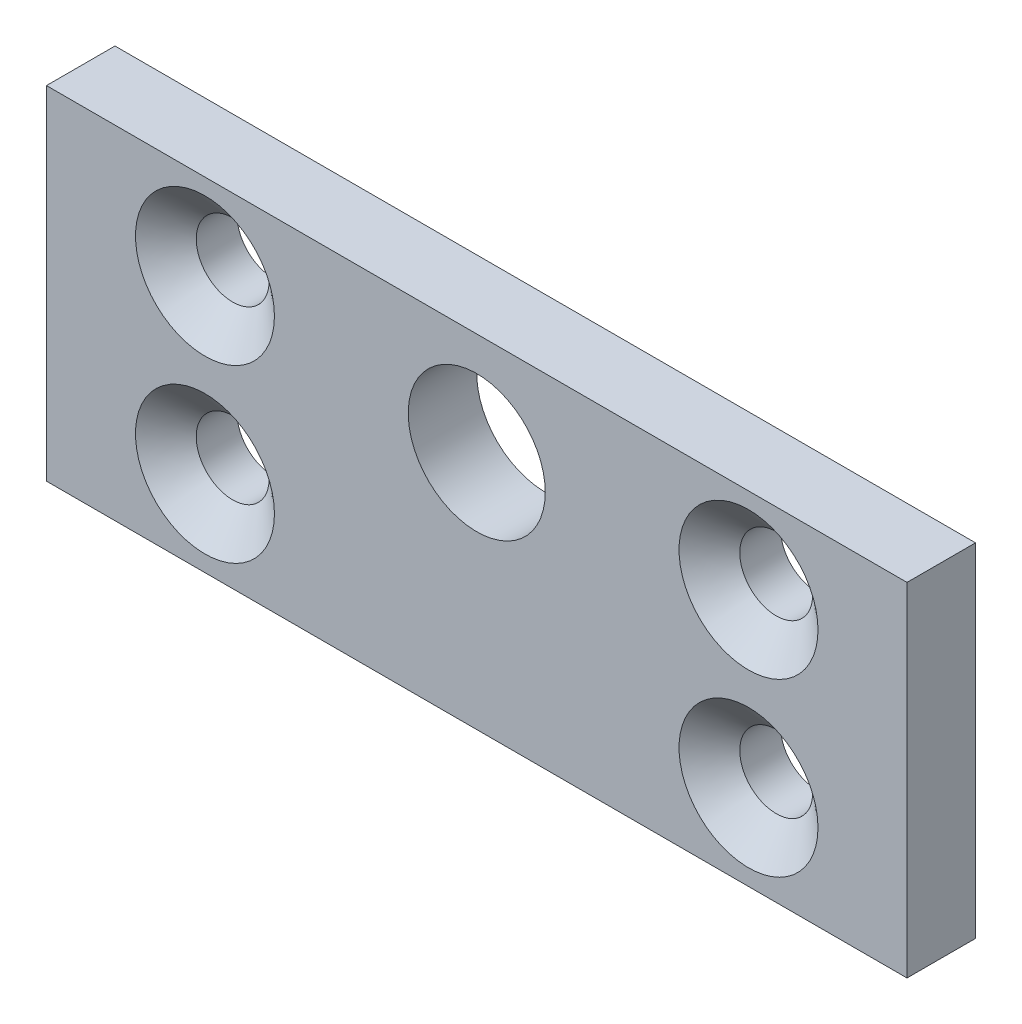
ISO-10303-21;
HEADER;
FILE_DESCRIPTION(('STEP AP214'),'2;1');
FILE_NAME('part.step','',(''),(''),'','','');
FILE_SCHEMA(('AUTOMOTIVE_DESIGN { 1 0 10303 214 1 1 1 1 }'));
ENDSEC;
DATA;
#1=APPLICATION_CONTEXT('core data for automotive mechanical design processes');
#2=APPLICATION_PROTOCOL_DEFINITION('international standard','automotive_design',2000,#1);
#3=PRODUCT_CONTEXT('',#1,'mechanical');
#4=PRODUCT('Part','Part','',(#3));
#5=PRODUCT_RELATED_PRODUCT_CATEGORY('part','',(#4));
#6=PRODUCT_DEFINITION_FORMATION('','',#4);
#7=PRODUCT_DEFINITION_CONTEXT('part definition',#1,'design');
#8=PRODUCT_DEFINITION('design','',#6,#7);
#9=PRODUCT_DEFINITION_SHAPE('','',#8);
#10=(LENGTH_UNIT() NAMED_UNIT(*) SI_UNIT(.MILLI.,.METRE.));
#11=(NAMED_UNIT(*) PLANE_ANGLE_UNIT() SI_UNIT($,.RADIAN.));
#12=(NAMED_UNIT(*) SI_UNIT($,.STERADIAN.) SOLID_ANGLE_UNIT());
#13=UNCERTAINTY_MEASURE_WITH_UNIT(LENGTH_MEASURE(1.E-05),#10,'distance_accuracy_value','');
#14=(GEOMETRIC_REPRESENTATION_CONTEXT(3) GLOBAL_UNCERTAINTY_ASSIGNED_CONTEXT((#13)) GLOBAL_UNIT_ASSIGNED_CONTEXT((#10,
#11,#12)) REPRESENTATION_CONTEXT('',''));
#15=CARTESIAN_POINT('',(0.,0.,0.));
#16=DIRECTION('',(0.,0.,1.));
#17=DIRECTION('',(1.,0.,0.));
#18=AXIS2_PLACEMENT_3D('',#15,#16,#17);
#19=CARTESIAN_POINT('',(0.,0.,6.35));
#20=DIRECTION('',(0.,0.,1.));
#21=DIRECTION('',(1.,0.,0.));
#22=AXIS2_PLACEMENT_3D('',#19,#20,#21);
#23=PLANE('',#22);
#24=CARTESIAN_POINT('',(-88.6857601730863,23.8125,6.35));
#25=DIRECTION('',(0.,0.,1.));
#26=DIRECTION('',(1.,0.,0.));
#27=AXIS2_PLACEMENT_3D('',#24,#25,#26);
#28=CIRCLE('',#27,6.4389);
#29=CARTESIAN_POINT('',(-82.2468601730863,23.8125,6.35));
#30=VERTEX_POINT('',#29);
#31=EDGE_CURVE('E149',#30,#30,#28,.T.);
#32=ORIENTED_EDGE('',*,*,#31,.F.);
#33=EDGE_LOOP('',(#32));
#34=FACE_BOUND('',#33,.T.);
#35=CARTESIAN_POINT('',(-88.6857601730863,7.93750000000001,6.35));
#36=DIRECTION('',(0.,0.,1.));
#37=DIRECTION('',(1.,0.,0.));
#38=AXIS2_PLACEMENT_3D('',#35,#36,#37);
#39=CIRCLE('',#38,6.4389);
#40=CARTESIAN_POINT('',(-82.2468601730863,7.93750000000001,6.35));
#41=VERTEX_POINT('',#40);
#42=EDGE_CURVE('E140',#41,#41,#39,.T.);
#43=ORIENTED_EDGE('',*,*,#42,.F.);
#44=EDGE_LOOP('',(#43));
#45=FACE_BOUND('',#44,.T.);
#46=CARTESIAN_POINT('',(-38.3142398269137,7.9375,6.35));
#47=DIRECTION('',(0.,0.,1.));
#48=DIRECTION('',(1.,0.,0.));
#49=AXIS2_PLACEMENT_3D('',#46,#47,#48);
#50=CIRCLE('',#49,6.4389);
#51=CARTESIAN_POINT('',(-31.8753398269137,7.9375,6.35));
#52=VERTEX_POINT('',#51);
#53=EDGE_CURVE('E131',#52,#52,#50,.T.);
#54=ORIENTED_EDGE('',*,*,#53,.F.);
#55=EDGE_LOOP('',(#54));
#56=FACE_BOUND('',#55,.T.);
#57=CARTESIAN_POINT('',(-38.3142398269137,23.8125,6.35));
#58=DIRECTION('',(0.,0.,1.));
#59=DIRECTION('',(1.,0.,0.));
#60=AXIS2_PLACEMENT_3D('',#57,#58,#59);
#61=CIRCLE('',#60,6.4389);
#62=CARTESIAN_POINT('',(-31.8753398269137,23.8125,6.35));
#63=VERTEX_POINT('',#62);
#64=EDGE_CURVE('E122',#63,#63,#61,.T.);
#65=ORIENTED_EDGE('',*,*,#64,.F.);
#66=EDGE_LOOP('',(#65));
#67=FACE_BOUND('',#66,.T.);
#68=DIRECTION('',(0.,-1.,0.));
#69=VECTOR('',#68,1.);
#70=CARTESIAN_POINT('',(-103.373081361365,31.75,6.35));
#71=LINE('',#70,#69);
#72=CARTESIAN_POINT('',(-103.373081361365,31.75,6.35));
#73=VERTEX_POINT('',#72);
#74=CARTESIAN_POINT('',(-103.373081361365,0.,6.35));
#75=VERTEX_POINT('',#74);
#76=EDGE_CURVE('E84',#73,#75,#71,.T.);
#77=ORIENTED_EDGE('',*,*,#76,.T.);
#78=DIRECTION('',(1.,0.,0.));
#79=VECTOR('',#78,1.);
#80=CARTESIAN_POINT('',(-103.373081361365,0.,6.35));
#81=LINE('',#80,#79);
#82=CARTESIAN_POINT('',(-23.6269186386353,0.,6.35));
#83=VERTEX_POINT('',#82);
#84=EDGE_CURVE('E79',#75,#83,#81,.T.);
#85=ORIENTED_EDGE('',*,*,#84,.T.);
#86=DIRECTION('',(0.,1.,0.));
#87=VECTOR('',#86,1.);
#88=CARTESIAN_POINT('',(-23.6269186386353,31.75,6.35));
#89=LINE('',#88,#87);
#90=CARTESIAN_POINT('',(-23.6269186386353,31.75,6.35));
#91=VERTEX_POINT('',#90);
#92=EDGE_CURVE('E82',#83,#91,#89,.T.);
#93=ORIENTED_EDGE('',*,*,#92,.T.);
#94=DIRECTION('',(-1.,0.,0.));
#95=VECTOR('',#94,1.);
#96=CARTESIAN_POINT('',(-103.373081361365,31.75,6.35));
#97=LINE('',#96,#95);
#98=EDGE_CURVE('E49',#91,#73,#97,.T.);
#99=ORIENTED_EDGE('',*,*,#98,.T.);
#100=EDGE_LOOP('',(#77,#85,#93,#99));
#101=FACE_BOUND('',#100,.T.);
#102=CARTESIAN_POINT('',(-63.5,22.225,6.35));
#103=DIRECTION('',(0.,0.,1.));
#104=DIRECTION('',(1.,0.,0.));
#105=AXIS2_PLACEMENT_3D('',#102,#103,#104);
#106=CIRCLE('',#105,6.35);
#107=CARTESIAN_POINT('',(-57.15,22.225,6.35));
#108=VERTEX_POINT('',#107);
#109=EDGE_CURVE('E99',#108,#108,#106,.T.);
#110=ORIENTED_EDGE('',*,*,#109,.F.);
#111=EDGE_LOOP('',(#110));
#112=FACE_BOUND('',#111,.T.);
#113=ADVANCED_FACE('F32',(#34,#45,#56,#67,#101,#112),#23,.T.);
#114=CARTESIAN_POINT('',(0.,0.,0.));
#115=DIRECTION('',(0.,0.,1.));
#116=DIRECTION('',(1.,0.,0.));
#117=AXIS2_PLACEMENT_3D('',#114,#115,#116);
#118=PLANE('',#117);
#119=CARTESIAN_POINT('',(-88.6857601730863,23.8125,0.));
#120=DIRECTION('',(0.,0.,1.));
#121=DIRECTION('',(1.,0.,0.));
#122=AXIS2_PLACEMENT_3D('',#119,#120,#121);
#123=CIRCLE('',#122,3.37819999999998);
#124=CARTESIAN_POINT('',(-85.3075601730864,23.8125,0.));
#125=VERTEX_POINT('',#124);
#126=EDGE_CURVE('E143',#125,#125,#123,.T.);
#127=ORIENTED_EDGE('',*,*,#126,.T.);
#128=EDGE_LOOP('',(#127));
#129=FACE_BOUND('',#128,.T.);
#130=CARTESIAN_POINT('',(-88.6857601730863,7.93750000000001,0.));
#131=DIRECTION('',(0.,0.,1.));
#132=DIRECTION('',(1.,0.,0.));
#133=AXIS2_PLACEMENT_3D('',#130,#131,#132);
#134=CIRCLE('',#133,3.37819999999998);
#135=CARTESIAN_POINT('',(-85.3075601730864,7.93750000000001,0.));
#136=VERTEX_POINT('',#135);
#137=EDGE_CURVE('E134',#136,#136,#134,.T.);
#138=ORIENTED_EDGE('',*,*,#137,.T.);
#139=EDGE_LOOP('',(#138));
#140=FACE_BOUND('',#139,.T.);
#141=CARTESIAN_POINT('',(-38.3142398269137,7.9375,0.));
#142=DIRECTION('',(0.,0.,1.));
#143=DIRECTION('',(1.,0.,0.));
#144=AXIS2_PLACEMENT_3D('',#141,#142,#143);
#145=CIRCLE('',#144,3.37819999999998);
#146=CARTESIAN_POINT('',(-34.9360398269137,7.9375,0.));
#147=VERTEX_POINT('',#146);
#148=EDGE_CURVE('E125',#147,#147,#145,.T.);
#149=ORIENTED_EDGE('',*,*,#148,.T.);
#150=EDGE_LOOP('',(#149));
#151=FACE_BOUND('',#150,.T.);
#152=CARTESIAN_POINT('',(-38.3142398269137,23.8125,0.));
#153=DIRECTION('',(0.,0.,1.));
#154=DIRECTION('',(1.,0.,0.));
#155=AXIS2_PLACEMENT_3D('',#152,#153,#154);
#156=CIRCLE('',#155,3.37819999999998);
#157=CARTESIAN_POINT('',(-34.9360398269137,23.8125,0.));
#158=VERTEX_POINT('',#157);
#159=EDGE_CURVE('E114',#158,#158,#156,.T.);
#160=ORIENTED_EDGE('',*,*,#159,.T.);
#161=EDGE_LOOP('',(#160));
#162=FACE_BOUND('',#161,.T.);
#163=DIRECTION('',(0.,-1.,0.));
#164=VECTOR('',#163,1.);
#165=CARTESIAN_POINT('',(-103.373081361365,31.75,0.));
#166=LINE('',#165,#164);
#167=CARTESIAN_POINT('',(-103.373081361365,31.75,0.));
#168=VERTEX_POINT('',#167);
#169=CARTESIAN_POINT('',(-103.373081361365,0.,0.));
#170=VERTEX_POINT('',#169);
#171=EDGE_CURVE('E96',#168,#170,#166,.T.);
#172=ORIENTED_EDGE('',*,*,#171,.F.);
#173=DIRECTION('',(-1.,0.,0.));
#174=VECTOR('',#173,1.);
#175=CARTESIAN_POINT('',(-103.373081361365,31.75,0.));
#176=LINE('',#175,#174);
#177=CARTESIAN_POINT('',(-23.6269186386353,31.75,0.));
#178=VERTEX_POINT('',#177);
#179=EDGE_CURVE('E72',#178,#168,#176,.T.);
#180=ORIENTED_EDGE('',*,*,#179,.F.);
#181=DIRECTION('',(0.,1.,0.));
#182=VECTOR('',#181,1.);
#183=CARTESIAN_POINT('',(-23.6269186386353,31.75,0.));
#184=LINE('',#183,#182);
#185=CARTESIAN_POINT('',(-23.6269186386353,0.,0.));
#186=VERTEX_POINT('',#185);
#187=EDGE_CURVE('E66',#186,#178,#184,.T.);
#188=ORIENTED_EDGE('',*,*,#187,.F.);
#189=DIRECTION('',(1.,0.,0.));
#190=VECTOR('',#189,1.);
#191=CARTESIAN_POINT('',(-103.373081361365,0.,0.));
#192=LINE('',#191,#190);
#193=EDGE_CURVE('E88',#170,#186,#192,.T.);
#194=ORIENTED_EDGE('',*,*,#193,.F.);
#195=EDGE_LOOP('',(#172,#180,#188,#194));
#196=FACE_BOUND('',#195,.T.);
#197=CARTESIAN_POINT('',(-63.5,22.225,0.));
#198=DIRECTION('',(0.,0.,1.));
#199=DIRECTION('',(1.,0.,0.));
#200=AXIS2_PLACEMENT_3D('',#197,#198,#199);
#201=CIRCLE('',#200,6.35);
#202=CARTESIAN_POINT('',(-57.15,22.225,0.));
#203=VERTEX_POINT('',#202);
#204=EDGE_CURVE('E111',#203,#203,#201,.T.);
#205=ORIENTED_EDGE('',*,*,#204,.T.);
#206=EDGE_LOOP('',(#205));
#207=FACE_BOUND('',#206,.T.);
#208=ADVANCED_FACE('F107',(#129,#140,#151,#162,#196,#207),#118,.F.);
#209=CARTESIAN_POINT('',(-103.373081361365,31.75,6.35));
#210=DIRECTION('',(1.,0.,0.));
#211=DIRECTION('',(0.,0.,-1.));
#212=AXIS2_PLACEMENT_3D('',#209,#210,#211);
#213=PLANE('',#212);
#214=ORIENTED_EDGE('',*,*,#171,.T.);
#215=DIRECTION('',(0.,0.,-1.));
#216=VECTOR('',#215,1.);
#217=CARTESIAN_POINT('',(-103.373081361365,0.,6.35));
#218=LINE('',#217,#216);
#219=EDGE_CURVE('E11',#75,#170,#218,.T.);
#220=ORIENTED_EDGE('',*,*,#219,.F.);
#221=ORIENTED_EDGE('',*,*,#76,.F.);
#222=DIRECTION('',(0.,0.,-1.));
#223=VECTOR('',#222,1.);
#224=CARTESIAN_POINT('',(-103.373081361365,31.75,6.35));
#225=LINE('',#224,#223);
#226=EDGE_CURVE('E92',#73,#168,#225,.T.);
#227=ORIENTED_EDGE('',*,*,#226,.T.);
#228=EDGE_LOOP('',(#214,#220,#221,#227));
#229=FACE_BOUND('',#228,.T.);
#230=ADVANCED_FACE('F34',(#229),#213,.F.);
#231=CARTESIAN_POINT('',(-103.373081361365,0.,6.35));
#232=DIRECTION('',(0.,1.,0.));
#233=DIRECTION('',(-1.,0.,0.));
#234=AXIS2_PLACEMENT_3D('',#231,#232,#233);
#235=PLANE('',#234);
#236=ORIENTED_EDGE('',*,*,#193,.T.);
#237=DIRECTION('',(0.,0.,-1.));
#238=VECTOR('',#237,1.);
#239=CARTESIAN_POINT('',(-23.6269186386353,0.,6.35));
#240=LINE('',#239,#238);
#241=EDGE_CURVE('E41',#83,#186,#240,.T.);
#242=ORIENTED_EDGE('',*,*,#241,.F.);
#243=ORIENTED_EDGE('',*,*,#84,.F.);
#244=ORIENTED_EDGE('',*,*,#219,.T.);
#245=EDGE_LOOP('',(#236,#242,#243,#244));
#246=FACE_BOUND('',#245,.T.);
#247=ADVANCED_FACE('F87',(#246),#235,.F.);
#248=CARTESIAN_POINT('',(-23.6269186386353,31.75,6.35));
#249=DIRECTION('',(-1.,0.,0.));
#250=DIRECTION('',(0.,0.,1.));
#251=AXIS2_PLACEMENT_3D('',#248,#249,#250);
#252=PLANE('',#251);
#253=ORIENTED_EDGE('',*,*,#187,.T.);
#254=DIRECTION('',(0.,0.,-1.));
#255=VECTOR('',#254,1.);
#256=CARTESIAN_POINT('',(-23.6269186386353,31.75,6.35));
#257=LINE('',#256,#255);
#258=EDGE_CURVE('E89',#91,#178,#257,.T.);
#259=ORIENTED_EDGE('',*,*,#258,.F.);
#260=ORIENTED_EDGE('',*,*,#92,.F.);
#261=ORIENTED_EDGE('',*,*,#241,.T.);
#262=EDGE_LOOP('',(#253,#259,#260,#261));
#263=FACE_BOUND('',#262,.T.);
#264=ADVANCED_FACE('F90',(#263),#252,.F.);
#265=CARTESIAN_POINT('',(-103.373081361365,31.75,6.35));
#266=DIRECTION('',(0.,-1.,0.));
#267=DIRECTION('',(1.,0.,0.));
#268=AXIS2_PLACEMENT_3D('',#265,#266,#267);
#269=PLANE('',#268);
#270=ORIENTED_EDGE('',*,*,#179,.T.);
#271=ORIENTED_EDGE('',*,*,#226,.F.);
#272=ORIENTED_EDGE('',*,*,#98,.F.);
#273=ORIENTED_EDGE('',*,*,#258,.T.);
#274=EDGE_LOOP('',(#270,#271,#272,#273));
#275=FACE_BOUND('',#274,.T.);
#276=ADVANCED_FACE('F104',(#275),#269,.F.);
#277=CARTESIAN_POINT('',(-63.5,22.225,6.35));
#278=DIRECTION('',(0.,0.,-1.));
#279=DIRECTION('',(-1.,0.,0.));
#280=AXIS2_PLACEMENT_3D('',#277,#278,#279);
#281=CYLINDRICAL_SURFACE('',#280,6.35);
#282=ORIENTED_EDGE('',*,*,#109,.T.);
#283=EDGE_LOOP('',(#282));
#284=FACE_BOUND('',#283,.T.);
#285=ORIENTED_EDGE('',*,*,#204,.F.);
#286=EDGE_LOOP('',(#285));
#287=FACE_BOUND('',#286,.T.);
#288=ADVANCED_FACE('F177',(#284,#287),#281,.F.);
#289=CARTESIAN_POINT('',(-38.3142398269137,23.8125,6.35));
#290=DIRECTION('',(0.,0.,1.));
#291=DIRECTION('',(1.,0.,0.));
#292=AXIS2_PLACEMENT_3D('',#289,#290,#291);
#293=CYLINDRICAL_SURFACE('',#292,3.37819999999998);
#294=ORIENTED_EDGE('',*,*,#159,.F.);
#295=EDGE_LOOP('',(#294));
#296=FACE_BOUND('',#295,.T.);
#297=CARTESIAN_POINT('',(-38.3142398269137,23.8125,3.78176775885568));
#298=DIRECTION('',(0.,0.,1.));
#299=DIRECTION('',(1.,0.,0.));
#300=AXIS2_PLACEMENT_3D('',#297,#298,#299);
#301=CIRCLE('',#300,3.37819999999998);
#302=CARTESIAN_POINT('',(-34.9360398269137,23.8125,3.78176775885568));
#303=VERTEX_POINT('',#302);
#304=EDGE_CURVE('E119',#303,#303,#301,.T.);
#305=ORIENTED_EDGE('',*,*,#304,.T.);
#306=EDGE_LOOP('',(#305));
#307=FACE_BOUND('',#306,.T.);
#308=ADVANCED_FACE('F167',(#296,#307),#293,.F.);
#309=CARTESIAN_POINT('',(-38.3142398269137,23.8125,6.35));
#310=DIRECTION('',(0.,0.,1.));
#311=DIRECTION('',(1.,0.,0.));
#312=AXIS2_PLACEMENT_3D('',#309,#310,#311);
#313=CONICAL_SURFACE('',#312,6.4389,0.872664625997164);
#314=ORIENTED_EDGE('',*,*,#304,.F.);
#315=EDGE_LOOP('',(#314));
#316=FACE_BOUND('',#315,.T.);
#317=ORIENTED_EDGE('',*,*,#64,.T.);
#318=EDGE_LOOP('',(#317));
#319=FACE_BOUND('',#318,.T.);
#320=ADVANCED_FACE('F164',(#316,#319),#313,.F.);
#321=CARTESIAN_POINT('',(-38.3142398269137,7.9375,6.35));
#322=DIRECTION('',(0.,0.,1.));
#323=DIRECTION('',(1.,0.,0.));
#324=AXIS2_PLACEMENT_3D('',#321,#322,#323);
#325=CYLINDRICAL_SURFACE('',#324,3.37819999999998);
#326=ORIENTED_EDGE('',*,*,#148,.F.);
#327=EDGE_LOOP('',(#326));
#328=FACE_BOUND('',#327,.T.);
#329=CARTESIAN_POINT('',(-38.3142398269137,7.9375,3.78176775885568));
#330=DIRECTION('',(0.,0.,1.));
#331=DIRECTION('',(1.,0.,0.));
#332=AXIS2_PLACEMENT_3D('',#329,#330,#331);
#333=CIRCLE('',#332,3.37819999999998);
#334=CARTESIAN_POINT('',(-34.9360398269137,7.9375,3.78176775885568));
#335=VERTEX_POINT('',#334);
#336=EDGE_CURVE('E128',#335,#335,#333,.T.);
#337=ORIENTED_EDGE('',*,*,#336,.T.);
#338=EDGE_LOOP('',(#337));
#339=FACE_BOUND('',#338,.T.);
#340=ADVANCED_FACE('F166',(#328,#339),#325,.F.);
#341=CARTESIAN_POINT('',(-38.3142398269137,7.9375,6.35));
#342=DIRECTION('',(0.,0.,1.));
#343=DIRECTION('',(1.,0.,0.));
#344=AXIS2_PLACEMENT_3D('',#341,#342,#343);
#345=CONICAL_SURFACE('',#344,6.4389,0.872664625997164);
#346=ORIENTED_EDGE('',*,*,#336,.F.);
#347=EDGE_LOOP('',(#346));
#348=FACE_BOUND('',#347,.T.);
#349=ORIENTED_EDGE('',*,*,#53,.T.);
#350=EDGE_LOOP('',(#349));
#351=FACE_BOUND('',#350,.T.);
#352=ADVANCED_FACE('F174',(#348,#351),#345,.F.);
#353=CARTESIAN_POINT('',(-88.6857601730863,7.93750000000001,6.35));
#354=DIRECTION('',(0.,0.,1.));
#355=DIRECTION('',(1.,0.,0.));
#356=AXIS2_PLACEMENT_3D('',#353,#354,#355);
#357=CYLINDRICAL_SURFACE('',#356,3.37819999999998);
#358=ORIENTED_EDGE('',*,*,#137,.F.);
#359=EDGE_LOOP('',(#358));
#360=FACE_BOUND('',#359,.T.);
#361=CARTESIAN_POINT('',(-88.6857601730863,7.93750000000001,3.78176775885568));
#362=DIRECTION('',(0.,0.,1.));
#363=DIRECTION('',(1.,0.,0.));
#364=AXIS2_PLACEMENT_3D('',#361,#362,#363);
#365=CIRCLE('',#364,3.37819999999998);
#366=CARTESIAN_POINT('',(-85.3075601730864,7.93750000000001,3.78176775885568));
#367=VERTEX_POINT('',#366);
#368=EDGE_CURVE('E137',#367,#367,#365,.T.);
#369=ORIENTED_EDGE('',*,*,#368,.T.);
#370=EDGE_LOOP('',(#369));
#371=FACE_BOUND('',#370,.T.);
#372=ADVANCED_FACE('F257',(#360,#371),#357,.F.);
#373=CARTESIAN_POINT('',(-88.6857601730863,7.93750000000001,6.35));
#374=DIRECTION('',(0.,0.,1.));
#375=DIRECTION('',(1.,0.,0.));
#376=AXIS2_PLACEMENT_3D('',#373,#374,#375);
#377=CONICAL_SURFACE('',#376,6.4389,0.872664625997164);
#378=ORIENTED_EDGE('',*,*,#368,.F.);
#379=EDGE_LOOP('',(#378));
#380=FACE_BOUND('',#379,.T.);
#381=ORIENTED_EDGE('',*,*,#42,.T.);
#382=EDGE_LOOP('',(#381));
#383=FACE_BOUND('',#382,.T.);
#384=ADVANCED_FACE('F266',(#380,#383),#377,.F.);
#385=CARTESIAN_POINT('',(-88.6857601730863,23.8125,6.35));
#386=DIRECTION('',(0.,0.,1.));
#387=DIRECTION('',(1.,0.,0.));
#388=AXIS2_PLACEMENT_3D('',#385,#386,#387);
#389=CYLINDRICAL_SURFACE('',#388,3.37819999999998);
#390=ORIENTED_EDGE('',*,*,#126,.F.);
#391=EDGE_LOOP('',(#390));
#392=FACE_BOUND('',#391,.T.);
#393=CARTESIAN_POINT('',(-88.6857601730863,23.8125,3.78176775885568));
#394=DIRECTION('',(0.,0.,1.));
#395=DIRECTION('',(1.,0.,0.));
#396=AXIS2_PLACEMENT_3D('',#393,#394,#395);
#397=CIRCLE('',#396,3.37819999999998);
#398=CARTESIAN_POINT('',(-85.3075601730864,23.8125,3.78176775885568));
#399=VERTEX_POINT('',#398);
#400=EDGE_CURVE('E146',#399,#399,#397,.T.);
#401=ORIENTED_EDGE('',*,*,#400,.T.);
#402=EDGE_LOOP('',(#401));
#403=FACE_BOUND('',#402,.T.);
#404=ADVANCED_FACE('F276',(#392,#403),#389,.F.);
#405=CARTESIAN_POINT('',(-88.6857601730863,23.8125,6.35));
#406=DIRECTION('',(0.,0.,1.));
#407=DIRECTION('',(1.,0.,0.));
#408=AXIS2_PLACEMENT_3D('',#405,#406,#407);
#409=CONICAL_SURFACE('',#408,6.4389,0.872664625997164);
#410=ORIENTED_EDGE('',*,*,#400,.F.);
#411=EDGE_LOOP('',(#410));
#412=FACE_BOUND('',#411,.T.);
#413=ORIENTED_EDGE('',*,*,#31,.T.);
#414=EDGE_LOOP('',(#413));
#415=FACE_BOUND('',#414,.T.);
#416=ADVANCED_FACE('F153',(#412,#415),#409,.F.);
#417=CLOSED_SHELL('',(#113,#208,#230,#247,#264,#276,#288,#308,#320,#340,#352,#372,#384,#404,#416));
#418=MANIFOLD_SOLID_BREP('B2',#417);
#419=ADVANCED_BREP_SHAPE_REPRESENTATION('',(#18,#418),#14);
#420=SHAPE_DEFINITION_REPRESENTATION(#9,#419);
ENDSEC;
END-ISO-10303-21;
